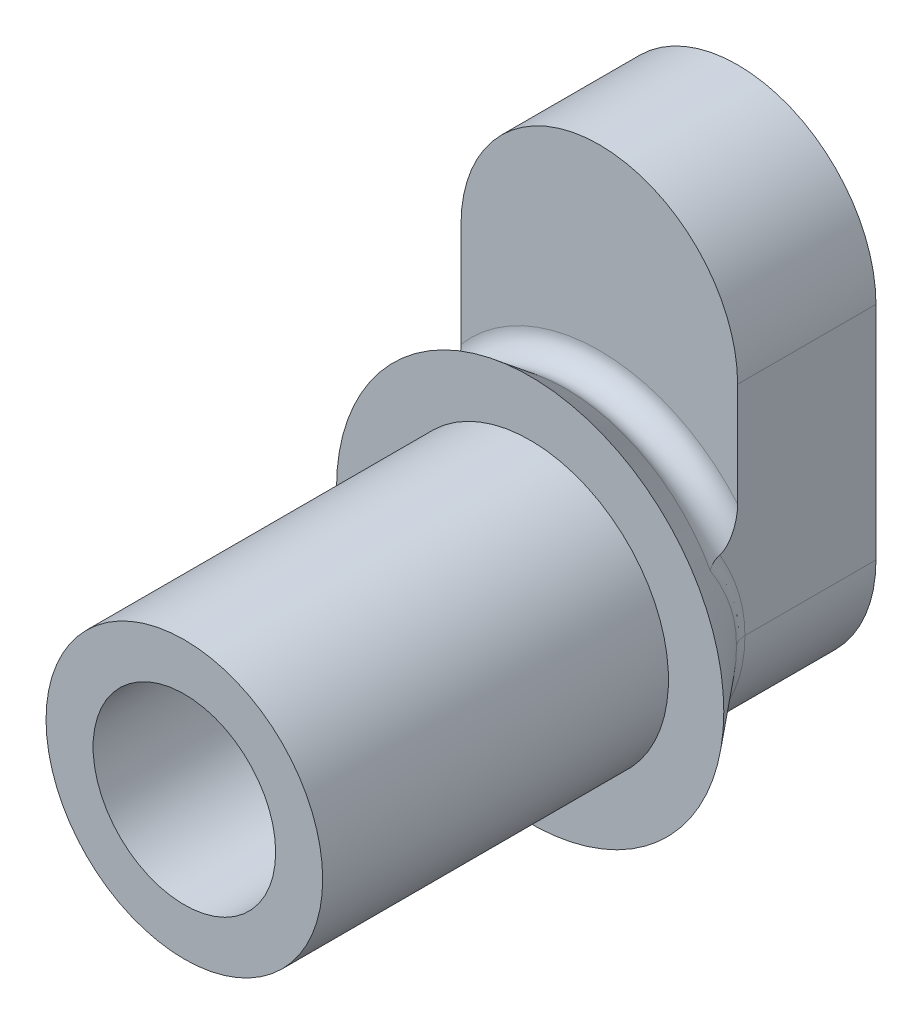
ISO-10303-21;
HEADER;
FILE_DESCRIPTION(('STEP AP214'),'2;1');
FILE_NAME('part.step','',(''),(''),'','','');
FILE_SCHEMA(('AUTOMOTIVE_DESIGN { 1 0 10303 214 1 1 1 1 }'));
ENDSEC;
DATA;
#1=APPLICATION_CONTEXT('core data for automotive mechanical design processes');
#2=APPLICATION_PROTOCOL_DEFINITION('international standard','automotive_design',2000,#1);
#3=PRODUCT_CONTEXT('',#1,'mechanical');
#4=PRODUCT('Part','Part','',(#3));
#5=PRODUCT_RELATED_PRODUCT_CATEGORY('part','',(#4));
#6=PRODUCT_DEFINITION_FORMATION('','',#4);
#7=PRODUCT_DEFINITION_CONTEXT('part definition',#1,'design');
#8=PRODUCT_DEFINITION('design','',#6,#7);
#9=PRODUCT_DEFINITION_SHAPE('','',#8);
#10=(LENGTH_UNIT() NAMED_UNIT(*) SI_UNIT(.MILLI.,.METRE.));
#11=(NAMED_UNIT(*) PLANE_ANGLE_UNIT() SI_UNIT($,.RADIAN.));
#12=(NAMED_UNIT(*) SI_UNIT($,.STERADIAN.) SOLID_ANGLE_UNIT());
#13=UNCERTAINTY_MEASURE_WITH_UNIT(LENGTH_MEASURE(1.E-05),#10,'distance_accuracy_value','');
#14=(GEOMETRIC_REPRESENTATION_CONTEXT(3) GLOBAL_UNCERTAINTY_ASSIGNED_CONTEXT((#13)) GLOBAL_UNIT_ASSIGNED_CONTEXT((#10,
#11,#12)) REPRESENTATION_CONTEXT('',''));
#15=CARTESIAN_POINT('',(0.,0.,0.));
#16=DIRECTION('',(0.,0.,1.));
#17=DIRECTION('',(1.,0.,0.));
#18=AXIS2_PLACEMENT_3D('',#15,#16,#17);
#19=CARTESIAN_POINT('',(0.,0.,20.));
#20=DIRECTION('',(0.,0.,-1.));
#21=DIRECTION('',(-1.,0.,0.));
#22=AXIS2_PLACEMENT_3D('',#19,#20,#21);
#23=CYLINDRICAL_SURFACE('',#22,5.);
#24=DIRECTION('',(0.,0.,-1.));
#25=VECTOR('',#24,1.);
#26=CARTESIAN_POINT('',(5.,0.,20.));
#27=LINE('',#26,#25);
#28=CARTESIAN_POINT('',(5.,0.,4.73691420548134));
#29=VERTEX_POINT('',#28);
#30=CARTESIAN_POINT('',(5.,0.,0.));
#31=VERTEX_POINT('',#30);
#32=EDGE_CURVE('E144',#29,#31,#27,.T.);
#33=ORIENTED_EDGE('',*,*,#32,.F.);
#34=CARTESIAN_POINT('',(0.,0.,4.73691420548134));
#35=DIRECTION('',(0.,0.,-1.));
#36=DIRECTION('',(-1.,0.,0.));
#37=AXIS2_PLACEMENT_3D('',#34,#35,#36);
#38=CIRCLE('',#37,5.);
#39=CARTESIAN_POINT('',(-5.,0.,4.73691420548134));
#40=VERTEX_POINT('',#39);
#41=EDGE_CURVE('E168',#29,#40,#38,.T.);
#42=ORIENTED_EDGE('',*,*,#41,.T.);
#43=DIRECTION('',(0.,0.,-1.));
#44=VECTOR('',#43,1.);
#45=CARTESIAN_POINT('',(-5.,0.,20.));
#46=LINE('',#45,#44);
#47=CARTESIAN_POINT('',(-5.,0.,0.));
#48=VERTEX_POINT('',#47);
#49=EDGE_CURVE('E149',#40,#48,#46,.T.);
#50=ORIENTED_EDGE('',*,*,#49,.T.);
#51=CARTESIAN_POINT('',(0.,0.,0.));
#52=DIRECTION('',(0.,0.,1.));
#53=DIRECTION('',(1.,0.,0.));
#54=AXIS2_PLACEMENT_3D('',#51,#52,#53);
#55=CIRCLE('',#54,5.);
#56=EDGE_CURVE('E320',#48,#31,#55,.T.);
#57=ORIENTED_EDGE('',*,*,#56,.T.);
#58=EDGE_LOOP('',(#33,#42,#50,#57));
#59=FACE_BOUND('',#58,.T.);
#60=ADVANCED_FACE('F44',(#59),#23,.T.);
#61=CARTESIAN_POINT('',(0.,8.,20.));
#62=DIRECTION('',(0.,0.,1.));
#63=DIRECTION('',(1.,0.,0.));
#64=AXIS2_PLACEMENT_3D('',#61,#62,#63);
#65=PLANE('',#64);
#66=CARTESIAN_POINT('',(0.,0.,20.));
#67=DIRECTION('',(0.,0.,1.));
#68=DIRECTION('',(1.,0.,0.));
#69=AXIS2_PLACEMENT_3D('',#66,#67,#68);
#70=CIRCLE('',#69,3.3);
#71=CARTESIAN_POINT('',(3.3,0.,20.));
#72=VERTEX_POINT('',#71);
#73=EDGE_CURVE('E307',#72,#72,#70,.T.);
#74=ORIENTED_EDGE('',*,*,#73,.F.);
#75=EDGE_LOOP('',(#74));
#76=FACE_BOUND('',#75,.T.);
#77=CARTESIAN_POINT('',(0.,0.,20.));
#78=DIRECTION('',(0.,0.,1.));
#79=DIRECTION('',(1.,0.,0.));
#80=AXIS2_PLACEMENT_3D('',#77,#78,#79);
#81=CIRCLE('',#80,5.);
#82=CARTESIAN_POINT('',(5.,0.,20.));
#83=VERTEX_POINT('',#82);
#84=EDGE_CURVE('E145',#83,#83,#81,.T.);
#85=ORIENTED_EDGE('',*,*,#84,.T.);
#86=EDGE_LOOP('',(#85));
#87=FACE_BOUND('',#86,.T.);
#88=ADVANCED_FACE('F345',(#76,#87),#65,.T.);
#89=CARTESIAN_POINT('',(0.,8.,20.));
#90=DIRECTION('',(0.,0.,-1.));
#91=DIRECTION('',(-1.,0.,0.));
#92=AXIS2_PLACEMENT_3D('',#89,#90,#91);
#93=CYLINDRICAL_SURFACE('',#92,5.);
#94=CARTESIAN_POINT('',(0.,8.,5.));
#95=DIRECTION('',(0.,0.,1.));
#96=DIRECTION('',(1.,0.,0.));
#97=AXIS2_PLACEMENT_3D('',#94,#95,#96);
#98=CIRCLE('',#97,5.);
#99=CARTESIAN_POINT('',(5.,8.,5.));
#100=VERTEX_POINT('',#99);
#101=CARTESIAN_POINT('',(-5.,8.,5.));
#102=VERTEX_POINT('',#101);
#103=EDGE_CURVE('E119',#100,#102,#98,.T.);
#104=ORIENTED_EDGE('',*,*,#103,.F.);
#105=DIRECTION('',(0.,0.,-1.));
#106=VECTOR('',#105,1.);
#107=CARTESIAN_POINT('',(5.,8.,20.));
#108=LINE('',#107,#106);
#109=CARTESIAN_POINT('',(5.,8.,0.));
#110=VERTEX_POINT('',#109);
#111=EDGE_CURVE('E133',#100,#110,#108,.T.);
#112=ORIENTED_EDGE('',*,*,#111,.T.);
#113=CARTESIAN_POINT('',(0.,8.,0.));
#114=DIRECTION('',(0.,0.,1.));
#115=DIRECTION('',(1.,0.,0.));
#116=AXIS2_PLACEMENT_3D('',#113,#114,#115);
#117=CIRCLE('',#116,5.);
#118=CARTESIAN_POINT('',(-5.,8.,0.));
#119=VERTEX_POINT('',#118);
#120=EDGE_CURVE('E311',#110,#119,#117,.T.);
#121=ORIENTED_EDGE('',*,*,#120,.T.);
#122=DIRECTION('',(0.,0.,-1.));
#123=VECTOR('',#122,1.);
#124=CARTESIAN_POINT('',(-5.,8.,20.));
#125=LINE('',#124,#123);
#126=EDGE_CURVE('E127',#102,#119,#125,.T.);
#127=ORIENTED_EDGE('',*,*,#126,.F.);
#128=EDGE_LOOP('',(#104,#112,#121,#127));
#129=FACE_BOUND('',#128,.T.);
#130=ADVANCED_FACE('F131',(#129),#93,.T.);
#131=CARTESIAN_POINT('',(-5.,8.,20.));
#132=DIRECTION('',(1.,0.,0.));
#133=DIRECTION('',(0.,1.,0.));
#134=AXIS2_PLACEMENT_3D('',#131,#132,#133);
#135=PLANE('',#134);
#136=ORIENTED_EDGE('',*,*,#49,.F.);
#137=CARTESIAN_POINT('',(-5.,-1.76956285078089,5.06958008244009));
#138=CARTESIAN_POINT('',(-5.,-1.67092067810893,5.33786980179241));
#139=CARTESIAN_POINT('',(-5.1902555748403,-1.59730146979058,5.5381013681059));
#140=CARTESIAN_POINT('',(-5.,-1.62674858629752,5.01702051510773));
#141=CARTESIAN_POINT('',(-5.,-1.53589851312261,5.28458776020732));
#142=CARTESIAN_POINT('',(-5.18634338598331,-1.46717142006155,5.48554180078377));
#143=CARTESIAN_POINT('',(-5.,-1.48190081188768,4.96961720836314));
#144=CARTESIAN_POINT('',(-5.,-1.39880962957373,5.23642375578943));
#145=CARTESIAN_POINT('',(-5.18273261482589,-1.33561810271383,5.43813849403408));
#146=CARTESIAN_POINT('',(-5.,-1.18861259438072,4.88671153191616));
#147=CARTESIAN_POINT('',(-5.,-1.12155515512928,5.15222736614229));
#148=CARTESIAN_POINT('',(-5.17632323305854,-1.06994690485726,5.35523281757686));
#149=CARTESIAN_POINT('',(-5.,-1.04016687250446,4.85122794557637));
#150=CARTESIAN_POINT('',(-5.,-0.981304410394588,5.11615789740964));
#151=CARTESIAN_POINT('',(-5.17352590521393,-0.935825325455816,5.31974923123194));
#152=CARTESIAN_POINT('',(-5.,-0.743701321221542,4.79451685067272));
#153=CARTESIAN_POINT('',(-5.,-0.701457934981345,5.05854819221858));
#154=CARTESIAN_POINT('',(-5.16901341615995,-0.668498767928289,5.26303813634858));
#155=CARTESIAN_POINT('',(-5.,-0.595735954100344,4.77301018294578));
#156=CARTESIAN_POINT('',(-5.,-0.56181200827558,5.03668009133788));
#157=CARTESIAN_POINT('',(-5.16727710844752,-0.535332019092328,5.24153146864642));
#158=CARTESIAN_POINT('',(-5.,-0.298513494885051,4.74421370699755));
#159=CARTESIAN_POINT('',(-5.,-0.281502093846656,5.00742347919186));
#160=CARTESIAN_POINT('',(-5.16494498380845,-0.268110060245561,5.21273499269727));
#161=CARTESIAN_POINT('',(-5.,-0.149257353986169,4.73691419942666));
#162=CARTESIAN_POINT('',(-5.,-0.140720288105614,4.99999998590893));
#163=CARTESIAN_POINT('',(-5.16434838879536,-0.134055519119275,5.2054354851007));
#164=CARTESIAN_POINT('',(-5.,0.1500448331742,4.73691421156797));
#165=CARTESIAN_POINT('',(-5.,0.141462726211963,5.00000001416541));
#166=CARTESIAN_POINT('',(-5.16434839706185,0.134762793692539,5.20543549722552));
#167=CARTESIAN_POINT('',(-5.,0.300090892269907,4.74429095868171));
#168=CARTESIAN_POINT('',(-5.,0.282990647100815,5.00750209270748));
#169=CARTESIAN_POINT('',(-5.16495131224155,0.269526575725039,5.21281224434864));
#170=CARTESIAN_POINT('',(-5.,0.598809398839181,4.77338480368192));
#171=CARTESIAN_POINT('',(-5.,0.564711540650823,5.03706084297502));
#172=CARTESIAN_POINT('',(-5.16730737712,0.53809693248084,5.2419060893495));
#173=CARTESIAN_POINT('',(-5.,0.747481409258962,4.79510631522686));
#174=CARTESIAN_POINT('',(-5.,0.705024599273043,5.05914763972609));
#175=CARTESIAN_POINT('',(-5.16906088083568,0.671903199779264,5.26362760088571));
#176=CARTESIAN_POINT('',(-5.,1.04376896073647,4.85205615697389));
#177=CARTESIAN_POINT('',(-5.,0.984706962349334,5.11699897460008));
#178=CARTESIAN_POINT('',(-5.17359122981541,0.93907761873481,5.32057744264675));
#179=CARTESIAN_POINT('',(-5.,1.19135790719112,4.88742111376948));
#180=CARTESIAN_POINT('',(-5.,1.12415335244215,5.15294709593067));
#181=CARTESIAN_POINT('',(-5.17637841516537,1.0724271085469,5.35594239946539));
#182=CARTESIAN_POINT('',(-5.,1.48310811176057,4.97002599135859));
#183=CARTESIAN_POINT('',(-5.,1.39994479829833,5.2368390687253));
#184=CARTESIAN_POINT('',(-5.18276388985133,1.33671846368257,5.43854727705618));
#185=CARTESIAN_POINT('',(-5.,1.62726965973764,5.01726490400834));
#186=CARTESIAN_POINT('',(-5.,1.53636880714871,5.2848371998541));
#187=CARTESIAN_POINT('',(-5.18636211032469,1.46766053239295,5.48578618968456));
#188=CARTESIAN_POINT('',(-5.,1.99246871851831,5.15153312712668));
#189=CARTESIAN_POINT('',(-5.,1.88250553108933,5.42126437077317));
#190=CARTESIAN_POINT('',(-5.19635478506951,1.80038726351718,5.62005441277621));
#191=CARTESIAN_POINT('',(-5.,2.21078963616881,5.24594333394169));
#192=CARTESIAN_POINT('',(-5.,2.08966214569265,5.51718997718673));
#193=CARTESIAN_POINT('',(-5.20317852452154,2.00028007949016,5.71446461960189));
#194=CARTESIAN_POINT('',(-5.,2.6384979698647,5.45364577126174));
#195=CARTESIAN_POINT('',(-5.,2.49608717063335,5.72793186516605));
#196=CARTESIAN_POINT('',(-5.2175482255036,2.39390261880134,5.92216705693318));
#197=CARTESIAN_POINT('',(-5.,2.84786874591575,5.56697140169029));
#198=CARTESIAN_POINT('',(-5.,2.69541502429123,5.84294925652187));
#199=CARTESIAN_POINT('',(-5.22509545431972,2.58762070547902,6.03549268736231));
#200=CARTESIAN_POINT('',(-5.,3.25421412737863,5.80517688608754));
#201=CARTESIAN_POINT('',(-5.,3.08292406843986,6.08445613033275));
#202=CARTESIAN_POINT('',(-5.24023654221098,2.96545082557481,6.27369817174846));
#203=CARTESIAN_POINT('',(-5.,3.45135328624085,5.92977880326231));
#204=CARTESIAN_POINT('',(-5.,3.27127027941878,6.21078832655063));
#205=CARTESIAN_POINT('',(-5.24782641676926,3.14967766670315,6.3983000889118));
#206=CARTESIAN_POINT('',(-5.,3.74150409264837,6.12397154400929));
#207=CARTESIAN_POINT('',(-5.,3.54856025099608,6.4072459787199));
#208=CARTESIAN_POINT('',(-5.25911438480979,3.42202338130153,6.59249282968324));
#209=CARTESIAN_POINT('',(-5.,3.83709553810895,6.189768522667));
#210=CARTESIAN_POINT('',(-5.,3.64013037994383,6.47390096010398));
#211=CARTESIAN_POINT('',(-5.26285298250416,3.51195084885446,6.65828980835595));
#212=CARTESIAN_POINT('',(-5.,4.02670056321478,6.32355138929406));
#213=CARTESIAN_POINT('',(-5.,3.82192052438827,6.60940003611175));
#214=CARTESIAN_POINT('',(-5.27028078980739,3.69069404621804,6.79207267499395));
#215=CARTESIAN_POINT('',(-5.,4.12071452529084,6.39153673472197));
#216=CARTESIAN_POINT('',(-5.,3.91213458199264,6.67824854964611));
#217=CARTESIAN_POINT('',(-5.27397001134136,3.77951004411641,6.8600580204178));
#218=CARTESIAN_POINT('',(-5.,4.21402448267725,6.46047670706849));
#219=CARTESIAN_POINT('',(-5.,4.00161523964876,6.74794226663665));
#220=CARTESIAN_POINT('',(-5.27762412729637,3.86783257092088,6.92899799273431));
#221=(BOUNDED_SURFACE() B_SPLINE_SURFACE(3,2,((#137,#138,#139),(#140,#141,#142),(#143,#144,
#145),(#146,#147,#148),(#149,#150,#151),(#152,#153,#154),(#155,#156,#157),(#158,#159,#160),
(#161,#162,#163),(#164,#165,#166),(#167,#168,#169),(#170,#171,#172),(#173,#174,#175),(#176,#177,
#178),(#179,#180,#181),(#182,#183,#184),(#185,#186,#187),(#188,#189,#190),(#191,#192,#193),
(#194,#195,#196),(#197,#198,#199),(#200,#201,#202),(#203,#204,#205),(#206,#207,#208),(#209,#210,
#211),(#212,#213,#214),(#215,#216,#217),(#218,#219,#220)),.UNSPECIFIED.,.F.,.F.,
.F.) B_SPLINE_SURFACE_WITH_KNOTS((4,2,2,2,2,2,2,2,2,2,2,2,2,4),(3,3),(0.,0.456630312862054,
0.913976854978461,1.36188268945778,1.8094826273873,2.25944409475755,2.70954407274035,
3.16427355961973,3.61896445127831,4.33124918545546,5.04480520667062,5.74402264036398,
6.09214084084853,6.4401733904689),(0.,1.),
.UNSPECIFIED.) GEOMETRIC_REPRESENTATION_ITEM() RATIONAL_B_SPLINE_SURFACE(((1.,0.934431886285172,
1.),(1.,0.935827499352324,1.),(1.,0.937112354848317,1.),(1.,0.939389408925105,1.),(1.,
0.940381145309543,1.),(1.,0.941979315501493,1.),(1.,0.942593280274405,1.),(1.,0.943417644986502,
1.),(1.,0.943628320253259,1.),(1.,0.943628318061811,1.),(1.,0.943415411689646,1.),(1.,
0.94258257722112,1.),(1.,0.941962523852363,1.),(1.,0.940357990546914,1.),(1.,0.939369827892785,
1.),(1.,0.937101219901487,1.),(1.,0.935820799378964,1.),(1.,0.932256118940903,1.),(1.,
0.929814110700651,1.),(1.,0.924648345131798,1.),(1.,0.921924092715991,1.),(1.,0.916433146821667,
1.),(1.,0.913668406205731,1.),(1.,0.909537783847125,1.),(1.,0.908166582024579,1.),(1.,
0.905436177725132,1.),(1.,0.904076972378925,1.),(1.,0.902727671265863,1.))) REPRESENTATION_ITEM('') SURFACE());
#222=CARTESIAN_POINT('',(-5.,-1.76956285078089,5.06958008244009));
#223=CARTESIAN_POINT('',(-5.,-1.62674858629752,5.01702051510773));
#224=CARTESIAN_POINT('',(-5.,-1.48190081188768,4.96961720836314));
#225=CARTESIAN_POINT('',(-5.,-1.18861259438072,4.88671153191616));
#226=CARTESIAN_POINT('',(-5.,-1.04016687250446,4.85122794557637));
#227=CARTESIAN_POINT('',(-5.,-0.743701321221542,4.79451685067272));
#228=CARTESIAN_POINT('',(-5.,-0.595735954100344,4.77301018294578));
#229=CARTESIAN_POINT('',(-5.,-0.298513494885051,4.74421370699755));
#230=CARTESIAN_POINT('',(-5.,-0.149257353986169,4.73691419942666));
#231=CARTESIAN_POINT('',(-5.,0.1500448331742,4.73691421156797));
#232=CARTESIAN_POINT('',(-5.,0.300090892269908,4.74429095868171));
#233=CARTESIAN_POINT('',(-5.,0.598809398839181,4.77338480368192));
#234=CARTESIAN_POINT('',(-5.,0.747481409258962,4.79510631522686));
#235=CARTESIAN_POINT('',(-5.,1.04376896073647,4.85205615697389));
#236=CARTESIAN_POINT('',(-5.,1.19135790719112,4.88742111376948));
#237=CARTESIAN_POINT('',(-5.,1.48310811176057,4.97002599135859));
#238=CARTESIAN_POINT('',(-5.,1.62726965973764,5.01726490400834));
#239=CARTESIAN_POINT('',(-5.,1.99246871851831,5.15153312712668));
#240=CARTESIAN_POINT('',(-5.,2.21078963616881,5.24594333394169));
#241=CARTESIAN_POINT('',(-5.,2.6384979698647,5.45364577126174));
#242=CARTESIAN_POINT('',(-5.,2.84786874591575,5.56697140169029));
#243=CARTESIAN_POINT('',(-5.,3.25421412737863,5.80517688608754));
#244=CARTESIAN_POINT('',(-5.,3.45135328624085,5.92977880326231));
#245=CARTESIAN_POINT('',(-5.,3.74150409264837,6.12397154400929));
#246=CARTESIAN_POINT('',(-5.,3.83709553810895,6.189768522667));
#247=CARTESIAN_POINT('',(-5.,4.02670056321478,6.32355138929406));
#248=CARTESIAN_POINT('',(-5.,4.12071452529084,6.39153673472197));
#249=CARTESIAN_POINT('',(-5.,4.21402448267725,6.46047670706849));
#250=B_SPLINE_CURVE_WITH_KNOTS('',3,(#222,#223,#224,#225,#226,#227,#228,#229,#230,#231,#232,
#233,#234,#235,#236,#237,#238,#239,#240,#241,#242,#243,#244,#245,#246,#247,#248,#249),
.UNSPECIFIED.,.F.,.F.,(4,2,2,2,2,2,2,2,2,2,2,2,2,4),(0.,0.456630312862054,0.913976854978461,
1.36188268945778,1.8094826273873,2.25944409475755,2.70954407274035,3.16427355961973,
3.61896445127831,4.33124918545546,5.04480520667062,5.74402264036398,6.09214084084853,
6.4401733904689),.UNSPECIFIED.);
#251=CARTESIAN_POINT('',(-5.,2.97527323959762,5.64211450905988));
#252=VERTEX_POINT('',#251);
#253=EDGE_CURVE('E73',#40,#252,#250,.T.);
#254=ORIENTED_EDGE('',*,*,#253,.T.);
#255=CARTESIAN_POINT('',(-5.,2.97527323959762,5.64211450905988));
#256=CARTESIAN_POINT('',(-5.,2.98347009340424,5.61326209851899));
#257=CARTESIAN_POINT('',(-5.,2.99469108646811,5.58551488181786));
#258=CARTESIAN_POINT('',(-5.,3.02164565455141,5.53277558881773));
#259=CARTESIAN_POINT('',(-5.,3.03731151460872,5.50774942776146));
#260=CARTESIAN_POINT('',(-5.,3.08005344096575,5.44899260611933));
#261=CARTESIAN_POINT('',(-5.,3.10903523113517,5.41668334586466));
#262=CARTESIAN_POINT('',(-5.,3.17164401775874,5.35654014197388));
#263=CARTESIAN_POINT('',(-5.,3.20530822148609,5.32874635151711));
#264=CARTESIAN_POINT('',(-5.,3.27131612379667,5.28038452462619));
#265=CARTESIAN_POINT('',(-5.,3.30332313234577,5.25934884614803));
#266=CARTESIAN_POINT('',(-5.,3.3690185378516,5.22007566904792));
#267=CARTESIAN_POINT('',(-5.,3.40270808758037,5.20184012474702));
#268=CARTESIAN_POINT('',(-5.,3.50567146238261,5.15093678967043));
#269=CARTESIAN_POINT('',(-5.,3.57684919267953,5.12206593337413));
#270=CARTESIAN_POINT('',(-5.,3.69779596007891,5.0816015227156));
#271=CARTESIAN_POINT('',(-5.,3.74675675020791,5.06745949586826));
#272=CARTESIAN_POINT('',(-5.,3.84567816769445,5.04312236503219));
#273=CARTESIAN_POINT('',(-5.,3.89563908923473,5.03292844084253));
#274=CARTESIAN_POINT('',(-5.,3.99573418691287,5.0165979936951));
#275=CARTESIAN_POINT('',(-5.,4.04586228274419,5.01042410296095));
#276=CARTESIAN_POINT('',(-5.,4.14642953476729,5.00213412023142));
#277=CARTESIAN_POINT('',(-5.,4.19686854822717,5.00001628787415));
#278=CARTESIAN_POINT('',(-5.,4.24732253530235,5.));
#279=B_SPLINE_CURVE_WITH_KNOTS('',3,(#255,#256,#257,#258,#259,#260,#261,#262,#263,#264,#265,
#266,#267,#268,#269,#270,#271,#272,#273,#274,#275,#276,#277,#278),.UNSPECIFIED.,.F.,.F.,(4,2,2,
2,2,2,2,2,2,2,2,4),(0.,0.0894674550042869,0.177639050167918,0.307157339438735,0.437770826664699,
0.552511500352535,0.667331895486556,0.896939525363586,1.04969646535179,1.20249901805883,
1.35386012968489,1.50515628115683),.UNSPECIFIED.);
#280=CARTESIAN_POINT('',(-5.,4.24732253530235,5.));
#281=VERTEX_POINT('',#280);
#282=EDGE_CURVE('E13',#252,#281,#279,.T.);
#283=ORIENTED_EDGE('',*,*,#282,.T.);
#284=DIRECTION('',(0.,-1.,0.));
#285=VECTOR('',#284,1.);
#286=CARTESIAN_POINT('',(-5.,8.,5.));
#287=LINE('',#286,#285);
#288=EDGE_CURVE('E136',#102,#281,#287,.T.);
#289=ORIENTED_EDGE('',*,*,#288,.F.);
#290=ORIENTED_EDGE('',*,*,#126,.T.);
#291=DIRECTION('',(0.,-1.,0.));
#292=VECTOR('',#291,1.);
#293=CARTESIAN_POINT('',(-5.,8.,0.));
#294=LINE('',#293,#292);
#295=EDGE_CURVE('E317',#119,#48,#294,.T.);
#296=ORIENTED_EDGE('',*,*,#295,.T.);
#297=EDGE_LOOP('',(#136,#254,#283,#289,#290,#296));
#298=FACE_BOUND('',#297,.T.);
#299=ADVANCED_FACE('F241',(#298),#135,.F.);
#300=CARTESIAN_POINT('',(5.,8.,20.));
#301=DIRECTION('',(-1.,0.,0.));
#302=DIRECTION('',(0.,-1.,0.));
#303=AXIS2_PLACEMENT_3D('',#300,#301,#302);
#304=PLANE('',#303);
#305=DIRECTION('',(0.,1.,0.));
#306=VECTOR('',#305,1.);
#307=CARTESIAN_POINT('',(5.,8.,5.));
#308=LINE('',#307,#306);
#309=CARTESIAN_POINT('',(5.,4.24732253530235,5.));
#310=VERTEX_POINT('',#309);
#311=EDGE_CURVE('E115',#310,#100,#308,.T.);
#312=ORIENTED_EDGE('',*,*,#311,.F.);
#313=CARTESIAN_POINT('',(5.,4.24732253530235,5.));
#314=CARTESIAN_POINT('',(5.,4.19470510693908,5.00001920005916));
#315=CARTESIAN_POINT('',(5.,4.14210288618414,5.00232114316708));
#316=CARTESIAN_POINT('',(5.,4.03723954762775,5.01132820670808));
#317=CARTESIAN_POINT('',(5.,3.98497868046145,5.01803626001173));
#318=CARTESIAN_POINT('',(5.,3.8806027974466,5.03579091686961));
#319=CARTESIAN_POINT('',(5.,3.82849586218616,5.04688492420483));
#320=CARTESIAN_POINT('',(5.,3.7254149343559,5.07338748184673));
#321=CARTESIAN_POINT('',(5.,3.6744404365535,5.08879406462377));
#322=CARTESIAN_POINT('',(5.,3.55962503302949,5.12910900394628));
#323=CARTESIAN_POINT('',(5.,3.49628824431357,5.1554752664909));
#324=CARTESIAN_POINT('',(5.,3.37375926820686,5.21625551130012));
#325=CARTESIAN_POINT('',(5.,3.31455169715683,5.25063729211485));
#326=CARTESIAN_POINT('',(5.,3.22732875329869,5.31195763465566));
#327=CARTESIAN_POINT('',(5.,3.19698864998414,5.33558363429204));
#328=CARTESIAN_POINT('',(5.,3.13936933578453,5.38641619642433));
#329=CARTESIAN_POINT('',(5.,3.1120906334632,5.41362335219999));
#330=CARTESIAN_POINT('',(5.,3.06753709962512,5.46576118274056));
#331=CARTESIAN_POINT('',(5.,3.04937235447947,5.48992386542012));
#332=CARTESIAN_POINT('',(5.,3.01710089600111,5.54077242106403));
#333=CARTESIAN_POINT('',(5.,3.00297651187337,5.56744660684241));
#334=CARTESIAN_POINT('',(5.,2.98526709074166,5.61052603208933));
#335=CARTESIAN_POINT('',(5.,2.97979612724882,5.62617248210845));
#336=CARTESIAN_POINT('',(5.,2.97527323959761,5.64211450905988));
#337=B_SPLINE_CURVE_WITH_KNOTS('',3,(#313,#314,#315,#316,#317,#318,#319,#320,#321,#322,#323,
#324,#325,#326,#327,#328,#329,#330,#331,#332,#333,#334,#335,#336),.UNSPECIFIED.,.F.,.F.,(4,2,2,
2,2,2,2,2,2,2,2,4),(0.,0.157781457596584,0.31566804696798,0.475309904918409,0.63487904771741,
0.840225620863483,1.04476103581274,1.15991995272636,1.27509797175282,1.36551534827358,
1.45553101115083,1.50518229987794),.UNSPECIFIED.);
#338=CARTESIAN_POINT('',(5.,2.97527323959762,5.64211450905988));
#339=VERTEX_POINT('',#338);
#340=EDGE_CURVE('E58',#310,#339,#337,.T.);
#341=ORIENTED_EDGE('',*,*,#340,.T.);
#342=CARTESIAN_POINT('',(5.1902555748403,-1.59730146979058,5.5381013681059));
#343=CARTESIAN_POINT('',(5.,-1.67092067810893,5.33786980179241));
#344=CARTESIAN_POINT('',(5.,-1.76956285078089,5.06958008244009));
#345=CARTESIAN_POINT('',(5.18634338598331,-1.46717142006155,5.48554180078377));
#346=CARTESIAN_POINT('',(5.,-1.53589851312261,5.28458776020732));
#347=CARTESIAN_POINT('',(5.,-1.62674858629752,5.01702051510773));
#348=CARTESIAN_POINT('',(5.18273261482589,-1.33561810271383,5.43813849403408));
#349=CARTESIAN_POINT('',(5.,-1.39880962957373,5.23642375578943));
#350=CARTESIAN_POINT('',(5.,-1.48190081188768,4.96961720836314));
#351=CARTESIAN_POINT('',(5.17632323305854,-1.06994690485726,5.35523281757686));
#352=CARTESIAN_POINT('',(5.,-1.12155515512928,5.15222736614229));
#353=CARTESIAN_POINT('',(5.,-1.18861259438072,4.88671153191616));
#354=CARTESIAN_POINT('',(5.17352590521393,-0.935825325455816,5.31974923123194));
#355=CARTESIAN_POINT('',(5.,-0.981304410394588,5.11615789740964));
#356=CARTESIAN_POINT('',(5.,-1.04016687250446,4.85122794557637));
#357=CARTESIAN_POINT('',(5.16901341615995,-0.668498767928289,5.26303813634858));
#358=CARTESIAN_POINT('',(5.,-0.701457934981345,5.05854819221858));
#359=CARTESIAN_POINT('',(5.,-0.743701321221542,4.79451685067272));
#360=CARTESIAN_POINT('',(5.16727710844752,-0.535332019092328,5.24153146864642));
#361=CARTESIAN_POINT('',(5.,-0.56181200827558,5.03668009133788));
#362=CARTESIAN_POINT('',(5.,-0.595735954100344,4.77301018294578));
#363=CARTESIAN_POINT('',(5.16494498380845,-0.268110060245561,5.21273499269727));
#364=CARTESIAN_POINT('',(5.,-0.281502093846656,5.00742347919186));
#365=CARTESIAN_POINT('',(5.,-0.298513494885051,4.74421370699755));
#366=CARTESIAN_POINT('',(5.16434838879536,-0.134055519119275,5.2054354851007));
#367=CARTESIAN_POINT('',(5.,-0.140720288105614,4.99999998590893));
#368=CARTESIAN_POINT('',(5.,-0.149257353986169,4.73691419942666));
#369=CARTESIAN_POINT('',(5.16434839706185,0.134762793692539,5.20543549722552));
#370=CARTESIAN_POINT('',(5.,0.141462726211963,5.00000001416541));
#371=CARTESIAN_POINT('',(5.,0.1500448331742,4.73691421156797));
#372=CARTESIAN_POINT('',(5.16495131224155,0.269526575725039,5.21281224434864));
#373=CARTESIAN_POINT('',(5.,0.282990647100815,5.00750209270748));
#374=CARTESIAN_POINT('',(5.,0.300090892269907,4.74429095868171));
#375=CARTESIAN_POINT('',(5.16730737712,0.53809693248084,5.2419060893495));
#376=CARTESIAN_POINT('',(5.,0.564711540650823,5.03706084297502));
#377=CARTESIAN_POINT('',(5.,0.598809398839181,4.77338480368192));
#378=CARTESIAN_POINT('',(5.16906088083568,0.671903199779264,5.26362760088571));
#379=CARTESIAN_POINT('',(5.,0.705024599273043,5.05914763972609));
#380=CARTESIAN_POINT('',(5.,0.747481409258962,4.79510631522686));
#381=CARTESIAN_POINT('',(5.17359122981541,0.93907761873481,5.32057744264675));
#382=CARTESIAN_POINT('',(5.,0.984706962349334,5.11699897460008));
#383=CARTESIAN_POINT('',(5.,1.04376896073647,4.85205615697389));
#384=CARTESIAN_POINT('',(5.17637841516537,1.0724271085469,5.35594239946539));
#385=CARTESIAN_POINT('',(5.,1.12415335244215,5.15294709593067));
#386=CARTESIAN_POINT('',(5.,1.19135790719112,4.88742111376948));
#387=CARTESIAN_POINT('',(5.18276388985133,1.33671846368257,5.43854727705618));
#388=CARTESIAN_POINT('',(5.,1.39994479829833,5.2368390687253));
#389=CARTESIAN_POINT('',(5.,1.48310811176057,4.97002599135859));
#390=CARTESIAN_POINT('',(5.18636211032469,1.46766053239295,5.48578618968456));
#391=CARTESIAN_POINT('',(5.,1.53636880714871,5.2848371998541));
#392=CARTESIAN_POINT('',(5.,1.62726965973764,5.01726490400834));
#393=CARTESIAN_POINT('',(5.19635478506951,1.80038726351718,5.62005441277621));
#394=CARTESIAN_POINT('',(5.,1.88250553108933,5.42126437077317));
#395=CARTESIAN_POINT('',(5.,1.99246871851831,5.15153312712668));
#396=CARTESIAN_POINT('',(5.20317852452154,2.00028007949016,5.71446461960189));
#397=CARTESIAN_POINT('',(5.,2.08966214569265,5.51718997718673));
#398=CARTESIAN_POINT('',(5.,2.21078963616881,5.24594333394169));
#399=CARTESIAN_POINT('',(5.2175482255036,2.39390261880134,5.92216705693318));
#400=CARTESIAN_POINT('',(5.,2.49608717063335,5.72793186516605));
#401=CARTESIAN_POINT('',(5.,2.6384979698647,5.45364577126174));
#402=CARTESIAN_POINT('',(5.22509545431972,2.58762070547902,6.03549268736231));
#403=CARTESIAN_POINT('',(5.,2.69541502429123,5.84294925652187));
#404=CARTESIAN_POINT('',(5.,2.84786874591575,5.56697140169029));
#405=CARTESIAN_POINT('',(5.24023654221098,2.96545082557481,6.27369817174846));
#406=CARTESIAN_POINT('',(5.,3.08292406843986,6.08445613033275));
#407=CARTESIAN_POINT('',(5.,3.25421412737863,5.80517688608754));
#408=CARTESIAN_POINT('',(5.24782641676926,3.14967766670315,6.3983000889118));
#409=CARTESIAN_POINT('',(5.,3.27127027941878,6.21078832655063));
#410=CARTESIAN_POINT('',(5.,3.45135328624085,5.92977880326231));
#411=CARTESIAN_POINT('',(5.25911438480979,3.42202338130153,6.59249282968324));
#412=CARTESIAN_POINT('',(5.,3.54856025099608,6.4072459787199));
#413=CARTESIAN_POINT('',(5.,3.74150409264837,6.12397154400929));
#414=CARTESIAN_POINT('',(5.26285298250416,3.51195084885446,6.65828980835595));
#415=CARTESIAN_POINT('',(5.,3.64013037994383,6.47390096010398));
#416=CARTESIAN_POINT('',(5.,3.83709553810895,6.189768522667));
#417=CARTESIAN_POINT('',(5.27028078980739,3.69069404621804,6.79207267499395));
#418=CARTESIAN_POINT('',(5.,3.82192052438827,6.60940003611175));
#419=CARTESIAN_POINT('',(5.,4.02670056321478,6.32355138929406));
#420=CARTESIAN_POINT('',(5.27397001134136,3.77951004411641,6.8600580204178));
#421=CARTESIAN_POINT('',(5.,3.91213458199264,6.67824854964611));
#422=CARTESIAN_POINT('',(5.,4.12071452529084,6.39153673472197));
#423=CARTESIAN_POINT('',(5.27762412729637,3.86783257092088,6.92899799273431));
#424=CARTESIAN_POINT('',(5.,4.00161523964876,6.74794226663665));
#425=CARTESIAN_POINT('',(5.,4.21402448267725,6.46047670706849));
#426=(BOUNDED_SURFACE() B_SPLINE_SURFACE(3,2,((#342,#343,#344),(#345,#346,#347),(#348,#349,
#350),(#351,#352,#353),(#354,#355,#356),(#357,#358,#359),(#360,#361,#362),(#363,#364,#365),
(#366,#367,#368),(#369,#370,#371),(#372,#373,#374),(#375,#376,#377),(#378,#379,#380),(#381,#382,
#383),(#384,#385,#386),(#387,#388,#389),(#390,#391,#392),(#393,#394,#395),(#396,#397,#398),
(#399,#400,#401),(#402,#403,#404),(#405,#406,#407),(#408,#409,#410),(#411,#412,#413),(#414,#415,
#416),(#417,#418,#419),(#420,#421,#422),(#423,#424,#425)),.UNSPECIFIED.,.F.,.F.,
.F.) B_SPLINE_SURFACE_WITH_KNOTS((4,2,2,2,2,2,2,2,2,2,2,2,2,4),(3,3),(0.,0.456630312862054,
0.913976854978461,1.36188268945778,1.8094826273873,2.25944409475755,2.70954407274035,
3.16427355961973,3.61896445127831,4.33124918545546,5.04480520667062,5.74402264036398,
6.09214084084853,6.4401733904689),(0.,1.),
.UNSPECIFIED.) GEOMETRIC_REPRESENTATION_ITEM() RATIONAL_B_SPLINE_SURFACE(((1.,0.934431886285172,
1.),(1.,0.935827499352324,1.),(1.,0.937112354848317,1.),(1.,0.939389408925105,1.),(1.,
0.940381145309543,1.),(1.,0.941979315501493,1.),(1.,0.942593280274405,1.),(1.,0.943417644986502,
1.),(1.,0.943628320253259,1.),(1.,0.943628318061811,1.),(1.,0.943415411689646,1.),(1.,
0.94258257722112,1.),(1.,0.941962523852363,1.),(1.,0.940357990546914,1.),(1.,0.939369827892785,
1.),(1.,0.937101219901487,1.),(1.,0.935820799378964,1.),(1.,0.932256118940903,1.),(1.,
0.929814110700651,1.),(1.,0.924648345131798,1.),(1.,0.921924092715991,1.),(1.,0.916433146821667,
1.),(1.,0.913668406205731,1.),(1.,0.909537783847125,1.),(1.,0.908166582024579,1.),(1.,
0.905436177725132,1.),(1.,0.904076972378925,1.),(1.,0.902727671265863,1.))) REPRESENTATION_ITEM('') SURFACE());
#427=CARTESIAN_POINT('',(5.,4.21402448267725,6.46047670706849));
#428=CARTESIAN_POINT('',(5.,4.12071452529084,6.39153673472197));
#429=CARTESIAN_POINT('',(5.,4.02670056321478,6.32355138929406));
#430=CARTESIAN_POINT('',(5.,3.83709553810895,6.189768522667));
#431=CARTESIAN_POINT('',(5.,3.74150409264837,6.12397154400929));
#432=CARTESIAN_POINT('',(5.,3.45135328624085,5.92977880326231));
#433=CARTESIAN_POINT('',(5.,3.25421412737863,5.80517688608754));
#434=CARTESIAN_POINT('',(5.,2.84786874591575,5.56697140169029));
#435=CARTESIAN_POINT('',(5.,2.6384979698647,5.45364577126174));
#436=CARTESIAN_POINT('',(5.,2.21078963616881,5.24594333394169));
#437=CARTESIAN_POINT('',(5.,1.99246871851831,5.15153312712668));
#438=CARTESIAN_POINT('',(5.,1.62726965973764,5.01726490400834));
#439=CARTESIAN_POINT('',(5.,1.48310811176057,4.97002599135859));
#440=CARTESIAN_POINT('',(5.,1.19135790719112,4.88742111376948));
#441=CARTESIAN_POINT('',(5.,1.04376896073647,4.85205615697389));
#442=CARTESIAN_POINT('',(5.,0.747481409258962,4.79510631522686));
#443=CARTESIAN_POINT('',(5.,0.598809398839181,4.77338480368192));
#444=CARTESIAN_POINT('',(5.,0.300090892269908,4.74429095868171));
#445=CARTESIAN_POINT('',(5.,0.1500448331742,4.73691421156797));
#446=CARTESIAN_POINT('',(5.,-0.149257353986169,4.73691419942666));
#447=CARTESIAN_POINT('',(5.,-0.298513494885051,4.74421370699755));
#448=CARTESIAN_POINT('',(5.,-0.595735954100344,4.77301018294578));
#449=CARTESIAN_POINT('',(5.,-0.743701321221542,4.79451685067272));
#450=CARTESIAN_POINT('',(5.,-1.04016687250446,4.85122794557637));
#451=CARTESIAN_POINT('',(5.,-1.18861259438072,4.88671153191616));
#452=CARTESIAN_POINT('',(5.,-1.48190081188768,4.96961720836314));
#453=CARTESIAN_POINT('',(5.,-1.62674858629752,5.01702051510773));
#454=CARTESIAN_POINT('',(5.,-1.76956285078089,5.06958008244009));
#455=B_SPLINE_CURVE_WITH_KNOTS('',3,(#427,#428,#429,#430,#431,#432,#433,#434,#435,#436,#437,
#438,#439,#440,#441,#442,#443,#444,#445,#446,#447,#448,#449,#450,#451,#452,#453,#454),
.UNSPECIFIED.,.F.,.F.,(4,2,2,2,2,2,2,2,2,2,2,2,2,4),(0.,0.348032549620377,0.696150750104929,
1.39536818379829,2.10892420501345,2.82120893919059,3.27589983084917,3.73062931772856,
4.18072929571135,4.6306907630816,5.07829070101112,5.52619653549044,5.98354307760685,
6.4401733904689),.UNSPECIFIED.);
#456=EDGE_CURVE('E66',#339,#29,#455,.T.);
#457=ORIENTED_EDGE('',*,*,#456,.T.);
#458=ORIENTED_EDGE('',*,*,#32,.T.);
#459=DIRECTION('',(0.,1.,0.));
#460=VECTOR('',#459,1.);
#461=CARTESIAN_POINT('',(5.,8.,0.));
#462=LINE('',#461,#460);
#463=EDGE_CURVE('E141',#31,#110,#462,.T.);
#464=ORIENTED_EDGE('',*,*,#463,.T.);
#465=ORIENTED_EDGE('',*,*,#111,.F.);
#466=EDGE_LOOP('',(#312,#341,#457,#458,#464,#465));
#467=FACE_BOUND('',#466,.T.);
#468=ADVANCED_FACE('F139',(#467),#304,.F.);
#469=CARTESIAN_POINT('',(0.,8.,0.));
#470=DIRECTION('',(0.,0.,1.));
#471=DIRECTION('',(1.,0.,0.));
#472=AXIS2_PLACEMENT_3D('',#469,#470,#471);
#473=PLANE('',#472);
#474=ORIENTED_EDGE('',*,*,#120,.F.);
#475=ORIENTED_EDGE('',*,*,#463,.F.);
#476=ORIENTED_EDGE('',*,*,#56,.F.);
#477=ORIENTED_EDGE('',*,*,#295,.F.);
#478=EDGE_LOOP('',(#474,#475,#476,#477));
#479=FACE_BOUND('',#478,.T.);
#480=CARTESIAN_POINT('',(0.,0.,0.));
#481=DIRECTION('',(0.,0.,1.));
#482=DIRECTION('',(1.,0.,0.));
#483=AXIS2_PLACEMENT_3D('',#480,#481,#482);
#484=CIRCLE('',#483,3.3);
#485=CARTESIAN_POINT('',(3.3,0.,0.));
#486=VERTEX_POINT('',#485);
#487=EDGE_CURVE('E306',#486,#486,#484,.T.);
#488=ORIENTED_EDGE('',*,*,#487,.T.);
#489=EDGE_LOOP('',(#488));
#490=FACE_BOUND('',#489,.T.);
#491=ADVANCED_FACE('F329',(#479,#490),#473,.F.);
#492=CARTESIAN_POINT('',(0.,0.,7.5));
#493=DIRECTION('',(0.,0.,-1.));
#494=DIRECTION('',(-1.,0.,0.));
#495=AXIS2_PLACEMENT_3D('',#492,#493,#494);
#496=CIRCLE('',#495,5.);
#497=CARTESIAN_POINT('',(-5.,0.,7.5));
#498=VERTEX_POINT('',#497);
#499=EDGE_CURVE('E294',#498,#498,#496,.T.);
#500=ORIENTED_EDGE('',*,*,#499,.F.);
#501=EDGE_LOOP('',(#500));
#502=FACE_BOUND('',#501,.T.);
#503=ORIENTED_EDGE('',*,*,#84,.F.);
#504=EDGE_LOOP('',(#503));
#505=FACE_BOUND('',#504,.T.);
#506=ADVANCED_FACE('F244',(#502,#505),#23,.T.);
#507=CARTESIAN_POINT('',(0.,0.,20.));
#508=DIRECTION('',(0.,0.,-1.));
#509=DIRECTION('',(-1.,0.,0.));
#510=AXIS2_PLACEMENT_3D('',#507,#508,#509);
#511=CYLINDRICAL_SURFACE('',#510,3.3);
#512=ORIENTED_EDGE('',*,*,#73,.T.);
#513=EDGE_LOOP('',(#512));
#514=FACE_BOUND('',#513,.T.);
#515=ORIENTED_EDGE('',*,*,#487,.F.);
#516=EDGE_LOOP('',(#515));
#517=FACE_BOUND('',#516,.T.);
#518=ADVANCED_FACE('F334',(#514,#517),#511,.F.);
#519=CARTESIAN_POINT('',(0.,8.,5.));
#520=DIRECTION('',(0.,0.,1.));
#521=DIRECTION('',(1.,0.,0.));
#522=AXIS2_PLACEMENT_3D('',#519,#520,#521);
#523=PLANE('',#522);
#524=ORIENTED_EDGE('',*,*,#288,.T.);
#525=CARTESIAN_POINT('',(0.,0.,5.));
#526=DIRECTION('',(0.,0.,1.));
#527=DIRECTION('',(1.,0.,0.));
#528=AXIS2_PLACEMENT_3D('',#525,#526,#527);
#529=CIRCLE('',#528,6.56046863561493);
#530=EDGE_CURVE('E122',#281,#310,#529,.F.);
#531=ORIENTED_EDGE('',*,*,#530,.T.);
#532=ORIENTED_EDGE('',*,*,#311,.T.);
#533=ORIENTED_EDGE('',*,*,#103,.T.);
#534=EDGE_LOOP('',(#524,#531,#532,#533));
#535=FACE_BOUND('',#534,.T.);
#536=ADVANCED_FACE('F118',(#535),#523,.T.);
#537=CARTESIAN_POINT('',(0.,0.,5.));
#538=DIRECTION('',(0.,0.,1.));
#539=DIRECTION('',(1.,0.,0.));
#540=AXIS2_PLACEMENT_3D('',#537,#538,#539);
#541=CONICAL_SURFACE('',#540,5.,0.674740942223553);
#542=CARTESIAN_POINT('',(0.,0.,6.21852128566582));
#543=DIRECTION('',(0.,0.,1.));
#544=DIRECTION('',(1.,0.,0.));
#545=AXIS2_PLACEMENT_3D('',#542,#543,#544);
#546=CIRCLE('',#545,5.97481702853266);
#547=CARTESIAN_POINT('',(5.23669875160413,2.8767037924318,6.21852128566582));
#548=VERTEX_POINT('',#547);
#549=CARTESIAN_POINT('',(-5.23669875160413,2.8767037924318,6.21852128566582));
#550=VERTEX_POINT('',#549);
#551=EDGE_CURVE('E254',#548,#550,#546,.T.);
#552=ORIENTED_EDGE('',*,*,#551,.T.);
#553=CARTESIAN_POINT('',(-5.27762412729637,3.86783257092088,6.92899799273431));
#554=CARTESIAN_POINT('',(-5.27397001134136,3.77951004411641,6.8600580204178));
#555=CARTESIAN_POINT('',(-5.27028078980739,3.69069404621804,6.79207267499395));
#556=CARTESIAN_POINT('',(-5.26285298250416,3.51195084885446,6.65828980835595));
#557=CARTESIAN_POINT('',(-5.25911438480979,3.42202338130153,6.59249282968324));
#558=CARTESIAN_POINT('',(-5.24782641676926,3.14967766670315,6.3983000889118));
#559=CARTESIAN_POINT('',(-5.24023654221098,2.96545082557481,6.27369817174846));
#560=CARTESIAN_POINT('',(-5.22509545431972,2.58762070547902,6.03549268736231));
#561=CARTESIAN_POINT('',(-5.2175482255036,2.39390261880134,5.92216705693318));
#562=CARTESIAN_POINT('',(-5.20317852452154,2.00028007949016,5.71446461960189));
#563=CARTESIAN_POINT('',(-5.19635478506951,1.80038726351718,5.62005441277621));
#564=CARTESIAN_POINT('',(-5.18636211032469,1.46766053239295,5.48578618968456));
#565=CARTESIAN_POINT('',(-5.18276388985133,1.33671846368257,5.43854727705618));
#566=CARTESIAN_POINT('',(-5.17637841516537,1.0724271085469,5.35594239946539));
#567=CARTESIAN_POINT('',(-5.1735912298154,0.93907761873481,5.32057744264675));
#568=CARTESIAN_POINT('',(-5.16906088083568,0.671903199779264,5.26362760088571));
#569=CARTESIAN_POINT('',(-5.16730737712,0.53809693248084,5.2419060893495));
#570=CARTESIAN_POINT('',(-5.16495131224155,0.269526575725039,5.21281224434864));
#571=CARTESIAN_POINT('',(-5.16434839706185,0.134762793692539,5.20543549722552));
#572=CARTESIAN_POINT('',(-5.16434838879536,-0.134055519119275,5.2054354851007));
#573=CARTESIAN_POINT('',(-5.16494498380845,-0.268110060245561,5.21273499269727));
#574=CARTESIAN_POINT('',(-5.16727710844752,-0.535332019092328,5.24153146864642));
#575=CARTESIAN_POINT('',(-5.16901341615995,-0.668498767928289,5.26303813634858));
#576=CARTESIAN_POINT('',(-5.17352590521393,-0.935825325455816,5.31974923123194));
#577=CARTESIAN_POINT('',(-5.17632323305854,-1.06994690485726,5.35523281757686));
#578=CARTESIAN_POINT('',(-5.18273261482589,-1.33561810271383,5.43813849403407));
#579=CARTESIAN_POINT('',(-5.18634338598331,-1.46717142006155,5.48554180078377));
#580=CARTESIAN_POINT('',(-5.1902555748403,-1.59730146979058,5.5381013681059));
#581=B_SPLINE_CURVE_WITH_KNOTS('',3,(#553,#554,#555,#556,#557,#558,#559,#560,#561,#562,#563,
#564,#565,#566,#567,#568,#569,#570,#571,#572,#573,#574,#575,#576,#577,#578,#579,#580),
.UNSPECIFIED.,.F.,.F.,(4,2,2,2,2,2,2,2,2,2,2,2,2,4),(0.,0.348032549620377,0.696150750104929,
1.39536818379829,2.10892420501345,2.82120893919059,3.27589983084917,3.73062931772856,
4.18072929571135,4.6306907630816,5.07829070101112,5.52619653549044,5.98354307760685,
6.4401733904689),.UNSPECIFIED.);
#582=CARTESIAN_POINT('',(-5.16434839291773,0.,5.20543549114716));
#583=VERTEX_POINT('',#582);
#584=EDGE_CURVE('E268',#550,#583,#581,.T.);
#585=ORIENTED_EDGE('',*,*,#584,.T.);
#586=CARTESIAN_POINT('',(0.,0.,5.20543549114716));
#587=DIRECTION('',(0.,0.,-1.));
#588=DIRECTION('',(-1.,0.,0.));
#589=AXIS2_PLACEMENT_3D('',#586,#587,#588);
#590=CIRCLE('',#589,5.16434839291773);
#591=CARTESIAN_POINT('',(5.16434839291773,0.,5.20543549114716));
#592=VERTEX_POINT('',#591);
#593=EDGE_CURVE('E265',#583,#592,#590,.F.);
#594=ORIENTED_EDGE('',*,*,#593,.T.);
#595=CARTESIAN_POINT('',(5.1902555748403,-1.59730146979058,5.5381013681059));
#596=CARTESIAN_POINT('',(5.18634338598331,-1.46717142006155,5.48554180078377));
#597=CARTESIAN_POINT('',(5.18273261482589,-1.33561810271383,5.43813849403407));
#598=CARTESIAN_POINT('',(5.17632323305854,-1.06994690485726,5.35523281757686));
#599=CARTESIAN_POINT('',(5.17352590521393,-0.935825325455816,5.31974923123194));
#600=CARTESIAN_POINT('',(5.16901341615995,-0.668498767928289,5.26303813634858));
#601=CARTESIAN_POINT('',(5.16727710844752,-0.535332019092328,5.24153146864642));
#602=CARTESIAN_POINT('',(5.16494498380845,-0.268110060245561,5.21273499269727));
#603=CARTESIAN_POINT('',(5.16434838879536,-0.134055519119275,5.2054354851007));
#604=CARTESIAN_POINT('',(5.16434839706185,0.134762793692539,5.20543549722552));
#605=CARTESIAN_POINT('',(5.16495131224155,0.269526575725039,5.21281224434864));
#606=CARTESIAN_POINT('',(5.16730737712,0.53809693248084,5.2419060893495));
#607=CARTESIAN_POINT('',(5.16906088083568,0.671903199779264,5.26362760088571));
#608=CARTESIAN_POINT('',(5.1735912298154,0.93907761873481,5.32057744264675));
#609=CARTESIAN_POINT('',(5.17637841516537,1.0724271085469,5.35594239946539));
#610=CARTESIAN_POINT('',(5.18276388985133,1.33671846368257,5.43854727705618));
#611=CARTESIAN_POINT('',(5.18636211032469,1.46766053239295,5.48578618968456));
#612=CARTESIAN_POINT('',(5.19635478506951,1.80038726351718,5.62005441277621));
#613=CARTESIAN_POINT('',(5.20317852452154,2.00028007949016,5.71446461960189));
#614=CARTESIAN_POINT('',(5.2175482255036,2.39390261880134,5.92216705693318));
#615=CARTESIAN_POINT('',(5.22509545431972,2.58762070547902,6.03549268736231));
#616=CARTESIAN_POINT('',(5.24023654221098,2.96545082557481,6.27369817174846));
#617=CARTESIAN_POINT('',(5.24782641676926,3.14967766670315,6.3983000889118));
#618=CARTESIAN_POINT('',(5.25911438480979,3.42202338130153,6.59249282968324));
#619=CARTESIAN_POINT('',(5.26285298250416,3.51195084885446,6.65828980835595));
#620=CARTESIAN_POINT('',(5.27028078980739,3.69069404621804,6.79207267499395));
#621=CARTESIAN_POINT('',(5.27397001134136,3.77951004411641,6.8600580204178));
#622=CARTESIAN_POINT('',(5.27762412729637,3.86783257092088,6.92899799273431));
#623=B_SPLINE_CURVE_WITH_KNOTS('',3,(#595,#596,#597,#598,#599,#600,#601,#602,#603,#604,#605,
#606,#607,#608,#609,#610,#611,#612,#613,#614,#615,#616,#617,#618,#619,#620,#621,#622),
.UNSPECIFIED.,.F.,.F.,(4,2,2,2,2,2,2,2,2,2,2,2,2,4),(0.,0.456630312862054,0.913976854978461,
1.36188268945778,1.8094826273873,2.25944409475755,2.70954407274035,3.16427355961973,
3.61896445127831,4.33124918545546,5.04480520667062,5.74402264036398,6.09214084084853,
6.4401733904689),.UNSPECIFIED.);
#624=EDGE_CURVE('E257',#592,#548,#623,.T.);
#625=ORIENTED_EDGE('',*,*,#624,.T.);
#626=EDGE_LOOP('',(#552,#585,#594,#625));
#627=FACE_BOUND('',#626,.T.);
#628=CARTESIAN_POINT('',(0.,0.,7.5));
#629=DIRECTION('',(0.,0.,-1.));
#630=DIRECTION('',(-1.,0.,0.));
#631=AXIS2_PLACEMENT_3D('',#628,#629,#630);
#632=CIRCLE('',#631,7.);
#633=CARTESIAN_POINT('',(-7.,0.,7.5));
#634=VERTEX_POINT('',#633);
#635=EDGE_CURVE('E137',#634,#634,#632,.T.);
#636=ORIENTED_EDGE('',*,*,#635,.T.);
#637=EDGE_LOOP('',(#636));
#638=FACE_BOUND('',#637,.T.);
#639=ADVANCED_FACE('F195',(#627,#638),#541,.T.);
#640=CARTESIAN_POINT('',(0.,5.,7.5));
#641=DIRECTION('',(0.,0.,1.));
#642=DIRECTION('',(1.,0.,0.));
#643=AXIS2_PLACEMENT_3D('',#640,#641,#642);
#644=PLANE('',#643);
#645=ORIENTED_EDGE('',*,*,#499,.T.);
#646=EDGE_LOOP('',(#645));
#647=FACE_BOUND('',#646,.T.);
#648=ORIENTED_EDGE('',*,*,#635,.F.);
#649=EDGE_LOOP('',(#648));
#650=FACE_BOUND('',#649,.T.);
#651=ADVANCED_FACE('F385',(#647,#650),#644,.T.);
#652=CARTESIAN_POINT('',(-5.75,0.,4.73691420548134));
#653=DIRECTION('',(0.,1.,0.));
#654=DIRECTION('',(-1.,0.,0.));
#655=AXIS2_PLACEMENT_3D('',#652,#653,#654);
#656=CIRCLE('',#655,0.75);
#657=EDGE_CURVE('E212',#583,#40,#656,.T.);
#658=ORIENTED_EDGE('',*,*,#657,.F.);
#659=ORIENTED_EDGE('',*,*,#584,.F.);
#660=CARTESIAN_POINT('',(-5.,2.97527323959762,5.64211450905988));
#661=CARTESIAN_POINT('',(-4.99995777821908,2.9615323936847,5.69041372206526));
#662=CARTESIAN_POINT('',(-5.00474133777705,2.94909949725959,5.73899426926122));
#663=CARTESIAN_POINT('',(-5.02320106245313,2.92704031667544,5.83501621434313));
#664=CARTESIAN_POINT('',(-5.03686202166937,2.91740927404502,5.88245941654265));
#665=CARTESIAN_POINT('',(-5.07051523628266,2.90192781392867,5.96998070479571));
#666=CARTESIAN_POINT('',(-5.0897201779113,2.89579209499773,6.01031658743883));
#667=CARTESIAN_POINT('',(-5.13402544819261,2.88595312164896,6.08784349894905));
#668=CARTESIAN_POINT('',(-5.15911401147836,2.8822450680657,6.12504060509649));
#669=CARTESIAN_POINT('',(-5.20124709371146,2.87846469516294,6.17861256146669));
#670=CARTESIAN_POINT('',(-5.21640401327152,2.8775017239738,6.19644121306148));
#671=CARTESIAN_POINT('',(-5.23370565617159,2.87681332555066,6.21529459603876));
#672=CARTESIAN_POINT('',(-5.23519931736789,2.8767570816188,6.2169106029241));
#673=CARTESIAN_POINT('',(-5.23669875160414,2.8767037924318,6.21852128566582));
#674=B_SPLINE_CURVE_WITH_KNOTS('',3,(#660,#661,#662,#663,#664,#665,#666,#667,#668,#669,#670,
#671,#672,#673),.UNSPECIFIED.,.F.,.F.,(4,2,2,2,2,2,4),(0.,0.150284480218982,0.300312217585131,
0.435047115196564,0.56951484941112,0.639704330265901,0.646308131774223),.UNSPECIFIED.);
#675=EDGE_CURVE('E223',#252,#550,#674,.T.);
#676=ORIENTED_EDGE('',*,*,#675,.F.);
#677=ORIENTED_EDGE('',*,*,#253,.F.);
#678=EDGE_LOOP('',(#658,#659,#676,#677));
#679=FACE_BOUND('',#678,.T.);
#680=ADVANCED_FACE('F218',(#679),#221,.F.);
#681=CARTESIAN_POINT('',(0.,0.,5.75));
#682=DIRECTION('',(0.,0.,1.));
#683=DIRECTION('',(1.,0.,0.));
#684=AXIS2_PLACEMENT_3D('',#681,#682,#683);
#685=TOROIDAL_SURFACE('',#684,6.56046863561493,0.75);
#686=ORIENTED_EDGE('',*,*,#675,.T.);
#687=ORIENTED_EDGE('',*,*,#551,.F.);
#688=CARTESIAN_POINT('',(5.,2.97527323959762,5.64211450905988));
#689=CARTESIAN_POINT('',(4.99997239324281,2.96280361041852,5.68595471810185));
#690=CARTESIAN_POINT('',(5.00390779584388,2.95140720638925,5.73003108981249));
#691=CARTESIAN_POINT('',(5.01916588546267,2.93090615387256,5.81739937107084));
#692=CARTESIAN_POINT('',(5.03048197422106,2.92179946846506,5.86069194583006));
#693=CARTESIAN_POINT('',(5.05994692068355,2.90600986018747,5.94526784681812));
#694=CARTESIAN_POINT('',(5.07808758767821,2.89932405063748,5.98655351488492));
#695=CARTESIAN_POINT('',(5.12052638568268,2.88842851726925,6.06610037952464));
#696=CARTESIAN_POINT('',(5.14481510622103,2.88421504160547,6.10436608220717));
#697=CARTESIAN_POINT('',(5.19067877286553,2.87918281172601,6.16601048954475));
#698=CARTESIAN_POINT('',(5.21085158436543,2.87772267964702,6.19039062790528));
#699=CARTESIAN_POINT('',(5.23370568495072,2.87681332196745,6.21529463947132));
#700=CARTESIAN_POINT('',(5.23519934742592,2.87675707781297,6.21691064864559));
#701=CARTESIAN_POINT('',(5.23669875160414,2.8767037924318,6.21852128566582));
#702=B_SPLINE_CURVE_WITH_KNOTS('',3,(#688,#689,#690,#691,#692,#693,#694,#695,#696,#697,#698,
#699,#700,#701),.UNSPECIFIED.,.F.,.F.,(4,2,2,2,2,2,4),(0.,0.136459936444581,0.272798045980991,
0.408973044834216,0.54494085572787,0.639772938297538,0.646376739805928),.UNSPECIFIED.);
#703=EDGE_CURVE('E205',#339,#548,#702,.T.);
#704=ORIENTED_EDGE('',*,*,#703,.F.);
#705=ORIENTED_EDGE('',*,*,#340,.F.);
#706=ORIENTED_EDGE('',*,*,#530,.F.);
#707=ORIENTED_EDGE('',*,*,#282,.F.);
#708=EDGE_LOOP('',(#686,#687,#704,#705,#706,#707));
#709=FACE_BOUND('',#708,.T.);
#710=ADVANCED_FACE('F214',(#709),#685,.F.);
#711=CARTESIAN_POINT('',(0.,0.,4.73691420548134));
#712=DIRECTION('',(0.,0.,-1.));
#713=DIRECTION('',(-1.,0.,0.));
#714=AXIS2_PLACEMENT_3D('',#711,#712,#713);
#715=TOROIDAL_SURFACE('',#714,5.75,0.75);
#716=ORIENTED_EDGE('',*,*,#657,.T.);
#717=ORIENTED_EDGE('',*,*,#41,.F.);
#718=CARTESIAN_POINT('',(5.75,0.,4.73691420548134));
#719=DIRECTION('',(0.,-1.,0.));
#720=DIRECTION('',(0.,0.,-1.));
#721=AXIS2_PLACEMENT_3D('',#718,#719,#720);
#722=CIRCLE('',#721,0.75);
#723=EDGE_CURVE('E240',#592,#29,#722,.T.);
#724=ORIENTED_EDGE('',*,*,#723,.F.);
#725=ORIENTED_EDGE('',*,*,#593,.F.);
#726=EDGE_LOOP('',(#716,#717,#724,#725));
#727=FACE_BOUND('',#726,.T.);
#728=ADVANCED_FACE('F188',(#727),#715,.F.);
#729=ORIENTED_EDGE('',*,*,#703,.T.);
#730=ORIENTED_EDGE('',*,*,#624,.F.);
#731=ORIENTED_EDGE('',*,*,#723,.T.);
#732=ORIENTED_EDGE('',*,*,#456,.F.);
#733=EDGE_LOOP('',(#729,#730,#731,#732));
#734=FACE_BOUND('',#733,.T.);
#735=ADVANCED_FACE('F181',(#734),#426,.F.);
#736=CLOSED_SHELL('',(#60,#88,#130,#299,#468,#491,#506,#518,#536,#639,#651,#680,#710,#728,#735));
#737=MANIFOLD_SOLID_BREP('B2',#736);
#738=ADVANCED_BREP_SHAPE_REPRESENTATION('',(#18,#737),#14);
#739=SHAPE_DEFINITION_REPRESENTATION(#9,#738);
ENDSEC;
END-ISO-10303-21;
